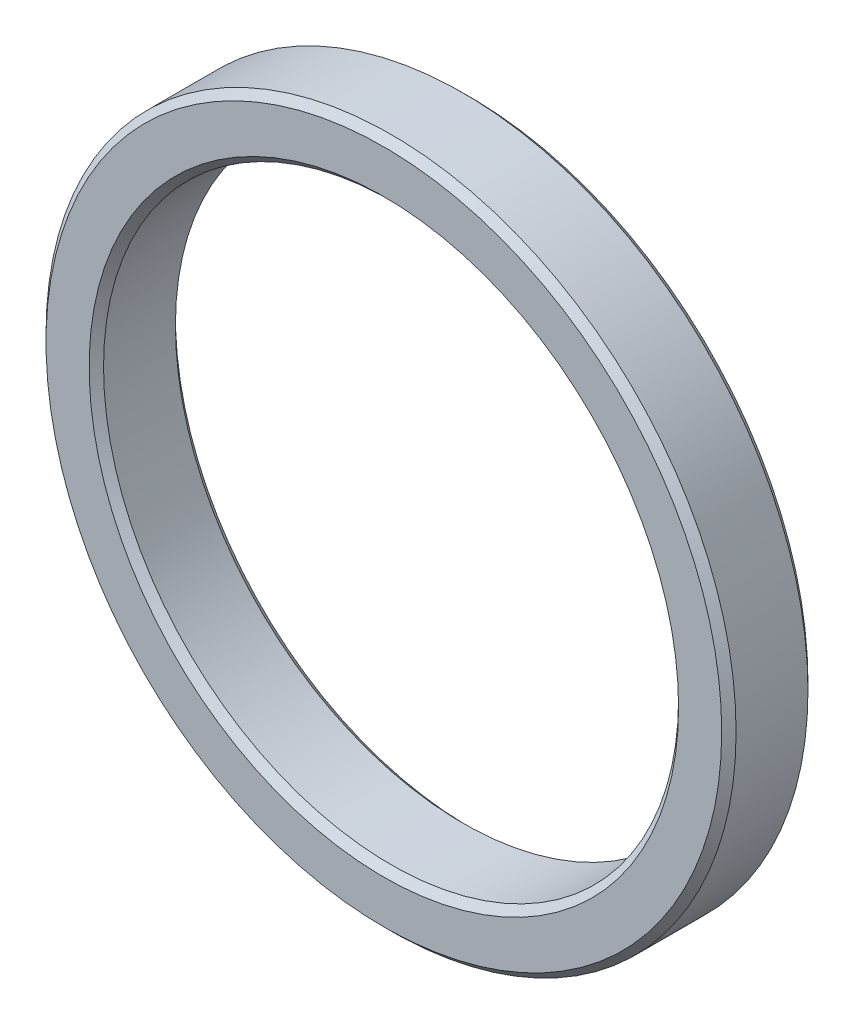
ISO-10303-21;
HEADER;
FILE_DESCRIPTION(('STEP AP214'),'2;1');
FILE_NAME('part.step','',(''),(''),'','','');
FILE_SCHEMA(('AUTOMOTIVE_DESIGN { 1 0 10303 214 1 1 1 1 }'));
ENDSEC;
DATA;
#1=APPLICATION_CONTEXT('core data for automotive mechanical design processes');
#2=APPLICATION_PROTOCOL_DEFINITION('international standard','automotive_design',2000,#1);
#3=PRODUCT_CONTEXT('',#1,'mechanical');
#4=PRODUCT('Part','Part','',(#3));
#5=PRODUCT_RELATED_PRODUCT_CATEGORY('part','',(#4));
#6=PRODUCT_DEFINITION_FORMATION('','',#4);
#7=PRODUCT_DEFINITION_CONTEXT('part definition',#1,'design');
#8=PRODUCT_DEFINITION('design','',#6,#7);
#9=PRODUCT_DEFINITION_SHAPE('','',#8);
#10=(LENGTH_UNIT() NAMED_UNIT(*) SI_UNIT(.MILLI.,.METRE.));
#11=(NAMED_UNIT(*) PLANE_ANGLE_UNIT() SI_UNIT($,.RADIAN.));
#12=(NAMED_UNIT(*) SI_UNIT($,.STERADIAN.) SOLID_ANGLE_UNIT());
#13=UNCERTAINTY_MEASURE_WITH_UNIT(LENGTH_MEASURE(1.E-05),#10,'distance_accuracy_value','');
#14=(GEOMETRIC_REPRESENTATION_CONTEXT(3) GLOBAL_UNCERTAINTY_ASSIGNED_CONTEXT((#13)) GLOBAL_UNIT_ASSIGNED_CONTEXT((#10,
#11,#12)) REPRESENTATION_CONTEXT('',''));
#15=CARTESIAN_POINT('',(0.,0.,0.));
#16=DIRECTION('',(0.,0.,1.));
#17=DIRECTION('',(1.,0.,0.));
#18=AXIS2_PLACEMENT_3D('',#15,#16,#17);
#19=CARTESIAN_POINT('',(0.,0.,6.));
#20=DIRECTION('',(0.,0.,1.));
#21=DIRECTION('',(1.,0.,0.));
#22=AXIS2_PLACEMENT_3D('',#19,#20,#21);
#23=PLANE('',#22);
#24=CARTESIAN_POINT('',(0.,0.,6.));
#25=DIRECTION('',(0.,0.,1.));
#26=DIRECTION('',(1.,0.,0.));
#27=AXIS2_PLACEMENT_3D('',#24,#25,#26);
#28=CIRCLE('',#27,23.5);
#29=CARTESIAN_POINT('',(23.5,0.,6.));
#30=VERTEX_POINT('',#29);
#31=EDGE_CURVE('E39',#30,#30,#28,.T.);
#32=ORIENTED_EDGE('',*,*,#31,.T.);
#33=EDGE_LOOP('',(#32));
#34=FACE_BOUND('',#33,.T.);
#35=CARTESIAN_POINT('',(0.,0.,6.));
#36=DIRECTION('',(0.,0.,1.));
#37=DIRECTION('',(1.,0.,0.));
#38=AXIS2_PLACEMENT_3D('',#35,#36,#37);
#39=CIRCLE('',#38,20.5);
#40=CARTESIAN_POINT('',(20.5,0.,6.));
#41=VERTEX_POINT('',#40);
#42=EDGE_CURVE('E43',#41,#41,#39,.F.);
#43=ORIENTED_EDGE('',*,*,#42,.T.);
#44=EDGE_LOOP('',(#43));
#45=FACE_BOUND('',#44,.T.);
#46=ADVANCED_FACE('F28',(#34,#45),#23,.T.);
#47=CARTESIAN_POINT('',(0.,0.,0.));
#48=DIRECTION('',(0.,0.,1.));
#49=DIRECTION('',(1.,0.,0.));
#50=AXIS2_PLACEMENT_3D('',#47,#48,#49);
#51=PLANE('',#50);
#52=CARTESIAN_POINT('',(0.,0.,0.));
#53=DIRECTION('',(0.,0.,1.));
#54=DIRECTION('',(1.,0.,0.));
#55=AXIS2_PLACEMENT_3D('',#52,#53,#54);
#56=CIRCLE('',#55,23.5);
#57=CARTESIAN_POINT('',(23.5,0.,0.));
#58=VERTEX_POINT('',#57);
#59=EDGE_CURVE('E48',#58,#58,#56,.F.);
#60=ORIENTED_EDGE('',*,*,#59,.T.);
#61=EDGE_LOOP('',(#60));
#62=FACE_BOUND('',#61,.T.);
#63=CARTESIAN_POINT('',(0.,0.,0.));
#64=DIRECTION('',(0.,0.,1.));
#65=DIRECTION('',(1.,0.,0.));
#66=AXIS2_PLACEMENT_3D('',#63,#64,#65);
#67=CIRCLE('',#66,20.5);
#68=CARTESIAN_POINT('',(20.5,0.,0.));
#69=VERTEX_POINT('',#68);
#70=EDGE_CURVE('E51',#69,#69,#67,.T.);
#71=ORIENTED_EDGE('',*,*,#70,.T.);
#72=EDGE_LOOP('',(#71));
#73=FACE_BOUND('',#72,.T.);
#74=ADVANCED_FACE('F73',(#62,#73),#51,.F.);
#75=CARTESIAN_POINT('',(0.,0.,6.));
#76=DIRECTION('',(0.,0.,-1.));
#77=DIRECTION('',(-1.,0.,0.));
#78=AXIS2_PLACEMENT_3D('',#75,#76,#77);
#79=CYLINDRICAL_SURFACE('',#78,24.);
#80=CARTESIAN_POINT('',(0.,0.,0.500000000000004));
#81=DIRECTION('',(0.,0.,1.));
#82=DIRECTION('',(1.,0.,0.));
#83=AXIS2_PLACEMENT_3D('',#80,#81,#82);
#84=CIRCLE('',#83,24.);
#85=CARTESIAN_POINT('',(24.,0.,0.500000000000004));
#86=VERTEX_POINT('',#85);
#87=EDGE_CURVE('E54',#86,#86,#84,.T.);
#88=ORIENTED_EDGE('',*,*,#87,.T.);
#89=EDGE_LOOP('',(#88));
#90=FACE_BOUND('',#89,.T.);
#91=CARTESIAN_POINT('',(0.,0.,5.49999999999998));
#92=DIRECTION('',(0.,0.,1.));
#93=DIRECTION('',(1.,0.,0.));
#94=AXIS2_PLACEMENT_3D('',#91,#92,#93);
#95=CIRCLE('',#94,24.);
#96=CARTESIAN_POINT('',(24.,0.,5.49999999999998));
#97=VERTEX_POINT('',#96);
#98=EDGE_CURVE('E57',#97,#97,#95,.F.);
#99=ORIENTED_EDGE('',*,*,#98,.T.);
#100=EDGE_LOOP('',(#99));
#101=FACE_BOUND('',#100,.T.);
#102=ADVANCED_FACE('F61',(#90,#101),#79,.T.);
#103=CARTESIAN_POINT('',(0.,0.,6.));
#104=DIRECTION('',(0.,0.,-1.));
#105=DIRECTION('',(-1.,0.,0.));
#106=AXIS2_PLACEMENT_3D('',#103,#104,#105);
#107=CYLINDRICAL_SURFACE('',#106,20.);
#108=CARTESIAN_POINT('',(0.,0.,0.500000000000004));
#109=DIRECTION('',(0.,0.,1.));
#110=DIRECTION('',(1.,0.,0.));
#111=AXIS2_PLACEMENT_3D('',#108,#109,#110);
#112=CIRCLE('',#111,20.);
#113=CARTESIAN_POINT('',(20.,0.,0.500000000000004));
#114=VERTEX_POINT('',#113);
#115=EDGE_CURVE('E10',#114,#114,#112,.F.);
#116=ORIENTED_EDGE('',*,*,#115,.T.);
#117=EDGE_LOOP('',(#116));
#118=FACE_BOUND('',#117,.T.);
#119=CARTESIAN_POINT('',(0.,0.,5.5));
#120=DIRECTION('',(0.,0.,1.));
#121=DIRECTION('',(1.,0.,0.));
#122=AXIS2_PLACEMENT_3D('',#119,#120,#121);
#123=CIRCLE('',#122,20.);
#124=CARTESIAN_POINT('',(20.,0.,5.5));
#125=VERTEX_POINT('',#124);
#126=EDGE_CURVE('E35',#125,#125,#123,.T.);
#127=ORIENTED_EDGE('',*,*,#126,.T.);
#128=EDGE_LOOP('',(#127));
#129=FACE_BOUND('',#128,.T.);
#130=ADVANCED_FACE('F89',(#118,#129),#107,.F.);
#131=CARTESIAN_POINT('',(0.,0.,0.500000000000004));
#132=DIRECTION('',(0.,0.,1.));
#133=DIRECTION('',(1.,0.,0.));
#134=AXIS2_PLACEMENT_3D('',#131,#132,#133);
#135=CONICAL_SURFACE('',#134,24.,0.785398163397445);
#136=ORIENTED_EDGE('',*,*,#59,.F.);
#137=EDGE_LOOP('',(#136));
#138=FACE_BOUND('',#137,.T.);
#139=ORIENTED_EDGE('',*,*,#87,.F.);
#140=EDGE_LOOP('',(#139));
#141=FACE_BOUND('',#140,.T.);
#142=ADVANCED_FACE('F67',(#138,#141),#135,.T.);
#143=CARTESIAN_POINT('',(0.,0.,6.));
#144=DIRECTION('',(0.,0.,-1.));
#145=DIRECTION('',(-1.,0.,0.));
#146=AXIS2_PLACEMENT_3D('',#143,#144,#145);
#147=CONICAL_SURFACE('',#146,23.5,0.785398163397445);
#148=ORIENTED_EDGE('',*,*,#98,.F.);
#149=EDGE_LOOP('',(#148));
#150=FACE_BOUND('',#149,.T.);
#151=ORIENTED_EDGE('',*,*,#31,.F.);
#152=EDGE_LOOP('',(#151));
#153=FACE_BOUND('',#152,.T.);
#154=ADVANCED_FACE('F63',(#150,#153),#147,.T.);
#155=CARTESIAN_POINT('',(0.,0.,0.));
#156=DIRECTION('',(0.,0.,-1.));
#157=DIRECTION('',(-1.,0.,0.));
#158=AXIS2_PLACEMENT_3D('',#155,#156,#157);
#159=CONICAL_SURFACE('',#158,20.5,0.785398163397441);
#160=ORIENTED_EDGE('',*,*,#115,.F.);
#161=EDGE_LOOP('',(#160));
#162=FACE_BOUND('',#161,.T.);
#163=ORIENTED_EDGE('',*,*,#70,.F.);
#164=EDGE_LOOP('',(#163));
#165=FACE_BOUND('',#164,.T.);
#166=ADVANCED_FACE('F66',(#162,#165),#159,.F.);
#167=CARTESIAN_POINT('',(0.,0.,5.5));
#168=DIRECTION('',(0.,0.,1.));
#169=DIRECTION('',(1.,0.,0.));
#170=AXIS2_PLACEMENT_3D('',#167,#168,#169);
#171=CONICAL_SURFACE('',#170,20.,0.785398163397459);
#172=ORIENTED_EDGE('',*,*,#42,.F.);
#173=EDGE_LOOP('',(#172));
#174=FACE_BOUND('',#173,.T.);
#175=ORIENTED_EDGE('',*,*,#126,.F.);
#176=EDGE_LOOP('',(#175));
#177=FACE_BOUND('',#176,.T.);
#178=ADVANCED_FACE('F30',(#174,#177),#171,.F.);
#179=CLOSED_SHELL('',(#46,#74,#102,#130,#142,#154,#166,#178));
#180=MANIFOLD_SOLID_BREP('B2',#179);
#181=ADVANCED_BREP_SHAPE_REPRESENTATION('',(#18,#180),#14);
#182=SHAPE_DEFINITION_REPRESENTATION(#9,#181);
ENDSEC;
END-ISO-10303-21;
